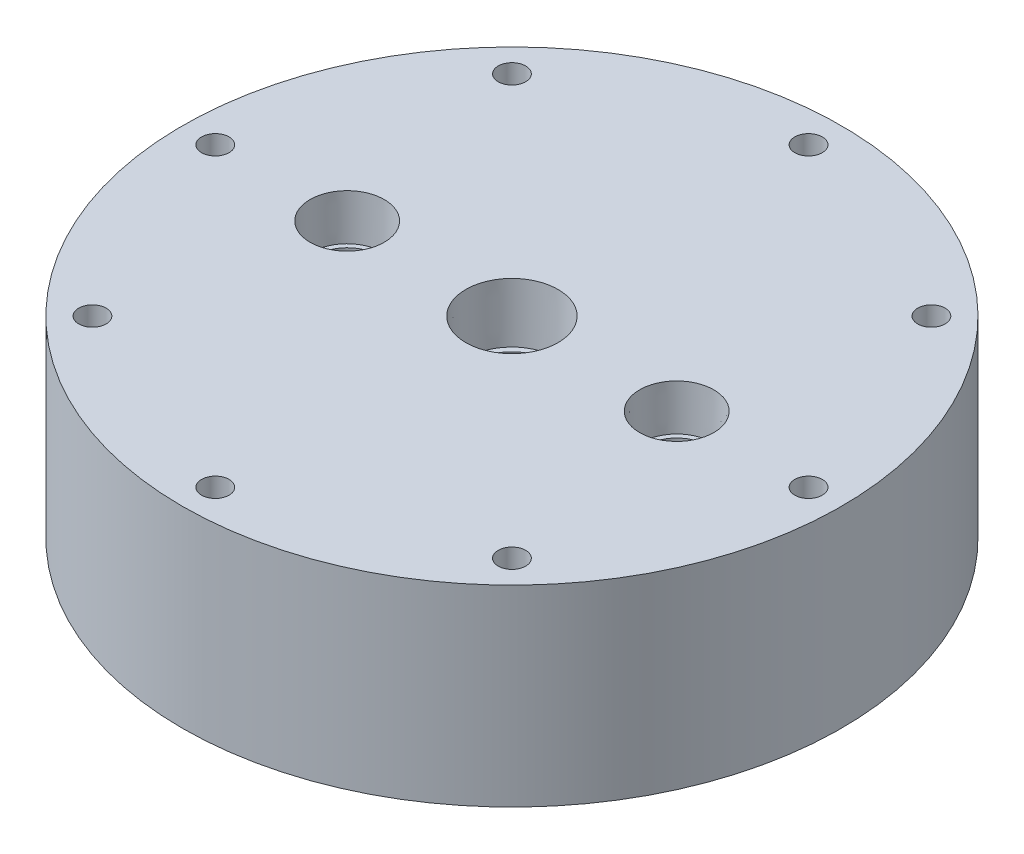
ISO-10303-21;
HEADER;
FILE_DESCRIPTION(('STEP AP214'),'2;1');
FILE_NAME('part.step','',(''),(''),'','','');
FILE_SCHEMA(('AUTOMOTIVE_DESIGN { 1 0 10303 214 1 1 1 1 }'));
ENDSEC;
DATA;
#1=APPLICATION_CONTEXT('core data for automotive mechanical design processes');
#2=APPLICATION_PROTOCOL_DEFINITION('international standard','automotive_design',2000,#1);
#3=PRODUCT_CONTEXT('',#1,'mechanical');
#4=PRODUCT('Part','Part','',(#3));
#5=PRODUCT_RELATED_PRODUCT_CATEGORY('part','',(#4));
#6=PRODUCT_DEFINITION_FORMATION('','',#4);
#7=PRODUCT_DEFINITION_CONTEXT('part definition',#1,'design');
#8=PRODUCT_DEFINITION('design','',#6,#7);
#9=PRODUCT_DEFINITION_SHAPE('','',#8);
#10=(LENGTH_UNIT() NAMED_UNIT(*) SI_UNIT(.MILLI.,.METRE.));
#11=(NAMED_UNIT(*) PLANE_ANGLE_UNIT() SI_UNIT($,.RADIAN.));
#12=(NAMED_UNIT(*) SI_UNIT($,.STERADIAN.) SOLID_ANGLE_UNIT());
#13=UNCERTAINTY_MEASURE_WITH_UNIT(LENGTH_MEASURE(1.E-05),#10,'distance_accuracy_value','');
#14=(GEOMETRIC_REPRESENTATION_CONTEXT(3) GLOBAL_UNCERTAINTY_ASSIGNED_CONTEXT((#13)) GLOBAL_UNIT_ASSIGNED_CONTEXT((#10,
#11,#12)) REPRESENTATION_CONTEXT('',''));
#15=CARTESIAN_POINT('',(0.,0.,0.));
#16=DIRECTION('',(0.,0.,1.));
#17=DIRECTION('',(1.,0.,0.));
#18=AXIS2_PLACEMENT_3D('',#15,#16,#17);
#19=CARTESIAN_POINT('',(76.2,44.45,0.));
#20=DIRECTION('',(0.,-1.,0.));
#21=DIRECTION('',(0.,0.,-1.));
#22=AXIS2_PLACEMENT_3D('',#19,#20,#21);
#23=PLANE('',#22);
#24=CARTESIAN_POINT('',(0.,44.45,-68.58));
#25=DIRECTION('',(0.,1.,0.));
#26=DIRECTION('',(0.,0.,1.));
#27=AXIS2_PLACEMENT_3D('',#24,#25,#26);
#28=CIRCLE('',#27,3.175);
#29=CARTESIAN_POINT('',(0.,44.45,-65.405));
#30=VERTEX_POINT('',#29);
#31=EDGE_CURVE('E131',#30,#30,#28,.T.);
#32=ORIENTED_EDGE('',*,*,#31,.F.);
#33=EDGE_LOOP('',(#32));
#34=FACE_BOUND('',#33,.T.);
#35=CARTESIAN_POINT('',(48.4933830537742,44.45,-48.4933830537727));
#36=DIRECTION('',(0.,1.,0.));
#37=DIRECTION('',(0.,0.,1.));
#38=AXIS2_PLACEMENT_3D('',#35,#36,#37);
#39=CIRCLE('',#38,3.17500000000031);
#40=CARTESIAN_POINT('',(48.4933830537742,44.45,-45.3183830537724));
#41=VERTEX_POINT('',#40);
#42=EDGE_CURVE('E135',#41,#41,#39,.T.);
#43=ORIENTED_EDGE('',*,*,#42,.F.);
#44=EDGE_LOOP('',(#43));
#45=FACE_BOUND('',#44,.T.);
#46=CARTESIAN_POINT('',(68.58,44.45,1.14838694109665E-12));
#47=DIRECTION('',(0.,1.,0.));
#48=DIRECTION('',(0.,0.,1.));
#49=AXIS2_PLACEMENT_3D('',#46,#47,#48);
#50=CIRCLE('',#49,3.17500000000001);
#51=CARTESIAN_POINT('',(68.58,44.45,3.17500000000116));
#52=VERTEX_POINT('',#51);
#53=EDGE_CURVE('E139',#52,#52,#50,.T.);
#54=ORIENTED_EDGE('',*,*,#53,.F.);
#55=EDGE_LOOP('',(#54));
#56=FACE_BOUND('',#55,.T.);
#57=CARTESIAN_POINT('',(48.4933830537725,44.45,48.4933830537744));
#58=DIRECTION('',(0.,1.,0.));
#59=DIRECTION('',(0.,0.,1.));
#60=AXIS2_PLACEMENT_3D('',#57,#58,#59);
#61=CIRCLE('',#60,3.175);
#62=CARTESIAN_POINT('',(48.4933830537725,44.45,51.6683830537744));
#63=VERTEX_POINT('',#62);
#64=EDGE_CURVE('E143',#63,#63,#61,.T.);
#65=ORIENTED_EDGE('',*,*,#64,.F.);
#66=EDGE_LOOP('',(#65));
#67=FACE_BOUND('',#66,.T.);
#68=CARTESIAN_POINT('',(-1.39471767468535E-12,44.45,68.58));
#69=DIRECTION('',(0.,1.,0.));
#70=DIRECTION('',(0.,0.,1.));
#71=AXIS2_PLACEMENT_3D('',#68,#69,#70);
#72=CIRCLE('',#71,3.175);
#73=CARTESIAN_POINT('',(-1.39471767468535E-12,44.45,71.755));
#74=VERTEX_POINT('',#73);
#75=EDGE_CURVE('E147',#74,#74,#72,.T.);
#76=ORIENTED_EDGE('',*,*,#75,.F.);
#77=EDGE_LOOP('',(#76));
#78=FACE_BOUND('',#77,.T.);
#79=CARTESIAN_POINT('',(-48.4933830537738,44.45,48.493383053773));
#80=DIRECTION('',(0.,1.,0.));
#81=DIRECTION('',(0.,0.,1.));
#82=AXIS2_PLACEMENT_3D('',#79,#80,#81);
#83=CIRCLE('',#82,3.17499999999999);
#84=CARTESIAN_POINT('',(-48.4933830537738,44.45,51.668383053773));
#85=VERTEX_POINT('',#84);
#86=EDGE_CURVE('E151',#85,#85,#83,.T.);
#87=ORIENTED_EDGE('',*,*,#86,.F.);
#88=EDGE_LOOP('',(#87));
#89=FACE_BOUND('',#88,.T.);
#90=CARTESIAN_POINT('',(-68.58,44.45,-6.86950496486816E-13));
#91=DIRECTION('',(0.,1.,0.));
#92=DIRECTION('',(0.,0.,1.));
#93=AXIS2_PLACEMENT_3D('',#90,#91,#92);
#94=CIRCLE('',#93,3.17499999999999);
#95=CARTESIAN_POINT('',(-68.58,44.45,3.1749999999993));
#96=VERTEX_POINT('',#95);
#97=EDGE_CURVE('E155',#96,#96,#94,.T.);
#98=ORIENTED_EDGE('',*,*,#97,.F.);
#99=EDGE_LOOP('',(#98));
#100=FACE_BOUND('',#99,.T.);
#101=CARTESIAN_POINT('',(-48.4933830537728,44.45,-48.493383053774));
#102=DIRECTION('',(0.,1.,0.));
#103=DIRECTION('',(0.,0.,1.));
#104=AXIS2_PLACEMENT_3D('',#101,#102,#103);
#105=CIRCLE('',#104,3.17499999999999);
#106=CARTESIAN_POINT('',(-48.4933830537728,44.45,-45.318383053774));
#107=VERTEX_POINT('',#106);
#108=EDGE_CURVE('E159',#107,#107,#105,.T.);
#109=ORIENTED_EDGE('',*,*,#108,.F.);
#110=EDGE_LOOP('',(#109));
#111=FACE_BOUND('',#110,.T.);
#112=CARTESIAN_POINT('',(-38.1,44.45,0.));
#113=DIRECTION('',(0.,1.,0.));
#114=DIRECTION('',(0.,0.,1.));
#115=AXIS2_PLACEMENT_3D('',#112,#113,#114);
#116=CIRCLE('',#115,8.5750146);
#117=CARTESIAN_POINT('',(-38.1,44.45,8.5750146));
#118=VERTEX_POINT('',#117);
#119=EDGE_CURVE('E163',#118,#118,#116,.T.);
#120=ORIENTED_EDGE('',*,*,#119,.F.);
#121=EDGE_LOOP('',(#120));
#122=FACE_BOUND('',#121,.T.);
#123=CARTESIAN_POINT('',(38.1,44.45,0.));
#124=DIRECTION('',(0.,1.,0.));
#125=DIRECTION('',(0.,0.,1.));
#126=AXIS2_PLACEMENT_3D('',#123,#124,#125);
#127=CIRCLE('',#126,8.5750146);
#128=CARTESIAN_POINT('',(38.1,44.45,8.57501459999999));
#129=VERTEX_POINT('',#128);
#130=EDGE_CURVE('E72',#129,#129,#127,.T.);
#131=ORIENTED_EDGE('',*,*,#130,.F.);
#132=EDGE_LOOP('',(#131));
#133=FACE_BOUND('',#132,.T.);
#134=CARTESIAN_POINT('',(0.,44.45,0.));
#135=DIRECTION('',(0.,1.,0.));
#136=DIRECTION('',(0.,0.,1.));
#137=AXIS2_PLACEMENT_3D('',#134,#135,#136);
#138=CIRCLE('',#137,10.6647361);
#139=CARTESIAN_POINT('',(0.,44.45,10.6647361));
#140=VERTEX_POINT('',#139);
#141=EDGE_CURVE('E59',#140,#140,#138,.T.);
#142=ORIENTED_EDGE('',*,*,#141,.F.);
#143=EDGE_LOOP('',(#142));
#144=FACE_BOUND('',#143,.T.);
#145=CARTESIAN_POINT('',(0.,44.45,0.));
#146=DIRECTION('',(0.,1.,0.));
#147=DIRECTION('',(0.,0.,1.));
#148=AXIS2_PLACEMENT_3D('',#145,#146,#147);
#149=CIRCLE('',#148,76.2);
#150=CARTESIAN_POINT('',(0.,44.45,76.2));
#151=VERTEX_POINT('',#150);
#152=EDGE_CURVE('E55',#151,#151,#149,.T.);
#153=ORIENTED_EDGE('',*,*,#152,.T.);
#154=EDGE_LOOP('',(#153));
#155=FACE_BOUND('',#154,.T.);
#156=ADVANCED_FACE('F37',(#34,#45,#56,#67,#78,#89,#100,#111,#122,#133,#144,#155),#23,.F.);
#157=CARTESIAN_POINT('',(0.,22.86,0.));
#158=DIRECTION('',(0.,1.,0.));
#159=DIRECTION('',(0.,0.,1.));
#160=AXIS2_PLACEMENT_3D('',#157,#158,#159);
#161=PLANE('',#160);
#162=CARTESIAN_POINT('',(0.,22.86,0.));
#163=DIRECTION('',(0.,1.,0.));
#164=DIRECTION('',(0.,0.,1.));
#165=AXIS2_PLACEMENT_3D('',#162,#163,#164);
#166=CIRCLE('',#165,8.9281);
#167=CARTESIAN_POINT('',(0.,22.86,8.9281));
#168=VERTEX_POINT('',#167);
#169=EDGE_CURVE('E53',#168,#168,#166,.T.);
#170=ORIENTED_EDGE('',*,*,#169,.T.);
#171=EDGE_LOOP('',(#170));
#172=FACE_BOUND('',#171,.T.);
#173=CARTESIAN_POINT('',(0.,22.86,0.));
#174=DIRECTION('',(0.,1.,0.));
#175=DIRECTION('',(0.,0.,1.));
#176=AXIS2_PLACEMENT_3D('',#173,#174,#175);
#177=CIRCLE('',#176,22.225);
#178=CARTESIAN_POINT('',(0.,22.86,22.225));
#179=VERTEX_POINT('',#178);
#180=EDGE_CURVE('E10',#179,#179,#177,.T.);
#181=ORIENTED_EDGE('',*,*,#180,.F.);
#182=EDGE_LOOP('',(#181));
#183=FACE_BOUND('',#182,.T.);
#184=ADVANCED_FACE('F118',(#172,#183),#161,.F.);
#185=CARTESIAN_POINT('',(0.,0.,0.));
#186=DIRECTION('',(0.,1.,0.));
#187=DIRECTION('',(0.,0.,1.));
#188=AXIS2_PLACEMENT_3D('',#185,#186,#187);
#189=CYLINDRICAL_SURFACE('',#188,22.225);
#190=CARTESIAN_POINT('',(0.,12.7,0.));
#191=DIRECTION('',(0.,1.,0.));
#192=DIRECTION('',(0.,0.,1.));
#193=AXIS2_PLACEMENT_3D('',#190,#191,#192);
#194=CIRCLE('',#193,22.225);
#195=CARTESIAN_POINT('',(0.,12.7,22.225));
#196=VERTEX_POINT('',#195);
#197=EDGE_CURVE('E44',#196,#196,#194,.T.);
#198=ORIENTED_EDGE('',*,*,#197,.F.);
#199=EDGE_LOOP('',(#198));
#200=FACE_BOUND('',#199,.T.);
#201=ORIENTED_EDGE('',*,*,#180,.T.);
#202=EDGE_LOOP('',(#201));
#203=FACE_BOUND('',#202,.T.);
#204=ADVANCED_FACE('F113',(#200,#203),#189,.F.);
#205=CARTESIAN_POINT('',(22.225,12.7,0.));
#206=DIRECTION('',(0.,1.,0.));
#207=DIRECTION('',(0.,0.,1.));
#208=AXIS2_PLACEMENT_3D('',#205,#206,#207);
#209=PLANE('',#208);
#210=CARTESIAN_POINT('',(0.,12.7,0.));
#211=DIRECTION('',(0.,1.,0.));
#212=DIRECTION('',(0.,0.,1.));
#213=AXIS2_PLACEMENT_3D('',#210,#211,#212);
#214=CIRCLE('',#213,25.4);
#215=CARTESIAN_POINT('',(0.,12.7,25.4));
#216=VERTEX_POINT('',#215);
#217=EDGE_CURVE('E49',#216,#216,#214,.T.);
#218=ORIENTED_EDGE('',*,*,#217,.F.);
#219=EDGE_LOOP('',(#218));
#220=FACE_BOUND('',#219,.T.);
#221=ORIENTED_EDGE('',*,*,#197,.T.);
#222=EDGE_LOOP('',(#221));
#223=FACE_BOUND('',#222,.T.);
#224=ADVANCED_FACE('F110',(#220,#223),#209,.F.);
#225=CARTESIAN_POINT('',(0.,0.,0.));
#226=DIRECTION('',(0.,1.,0.));
#227=DIRECTION('',(0.,0.,1.));
#228=AXIS2_PLACEMENT_3D('',#225,#226,#227);
#229=CYLINDRICAL_SURFACE('',#228,25.4);
#230=CARTESIAN_POINT('',(0.,14.732,0.));
#231=DIRECTION('',(0.,1.,0.));
#232=DIRECTION('',(0.,0.,1.));
#233=AXIS2_PLACEMENT_3D('',#230,#231,#232);
#234=CIRCLE('',#233,25.4);
#235=CARTESIAN_POINT('',(0.,14.732,25.4));
#236=VERTEX_POINT('',#235);
#237=EDGE_CURVE('E103',#236,#236,#234,.T.);
#238=ORIENTED_EDGE('',*,*,#237,.F.);
#239=EDGE_LOOP('',(#238));
#240=FACE_BOUND('',#239,.T.);
#241=ORIENTED_EDGE('',*,*,#217,.T.);
#242=EDGE_LOOP('',(#241));
#243=FACE_BOUND('',#242,.T.);
#244=ADVANCED_FACE('F108',(#240,#243),#229,.T.);
#245=CARTESIAN_POINT('',(25.4,14.732,0.));
#246=DIRECTION('',(0.,1.,0.));
#247=DIRECTION('',(0.,0.,1.));
#248=AXIS2_PLACEMENT_3D('',#245,#246,#247);
#249=PLANE('',#248);
#250=CARTESIAN_POINT('',(0.,14.732,0.));
#251=DIRECTION('',(0.,1.,0.));
#252=DIRECTION('',(0.,0.,1.));
#253=AXIS2_PLACEMENT_3D('',#250,#251,#252);
#254=CIRCLE('',#253,27.432);
#255=CARTESIAN_POINT('',(0.,14.732,27.432));
#256=VERTEX_POINT('',#255);
#257=EDGE_CURVE('E100',#256,#256,#254,.T.);
#258=ORIENTED_EDGE('',*,*,#257,.F.);
#259=EDGE_LOOP('',(#258));
#260=FACE_BOUND('',#259,.T.);
#261=ORIENTED_EDGE('',*,*,#237,.T.);
#262=EDGE_LOOP('',(#261));
#263=FACE_BOUND('',#262,.T.);
#264=ADVANCED_FACE('F213',(#260,#263),#249,.F.);
#265=CARTESIAN_POINT('',(0.,0.,0.));
#266=DIRECTION('',(0.,1.,0.));
#267=DIRECTION('',(0.,0.,1.));
#268=AXIS2_PLACEMENT_3D('',#265,#266,#267);
#269=CYLINDRICAL_SURFACE('',#268,27.432);
#270=CARTESIAN_POINT('',(0.,12.7,0.));
#271=DIRECTION('',(0.,1.,0.));
#272=DIRECTION('',(0.,0.,1.));
#273=AXIS2_PLACEMENT_3D('',#270,#271,#272);
#274=CIRCLE('',#273,27.432);
#275=CARTESIAN_POINT('',(0.,12.7,27.432));
#276=VERTEX_POINT('',#275);
#277=EDGE_CURVE('E97',#276,#276,#274,.T.);
#278=ORIENTED_EDGE('',*,*,#277,.F.);
#279=EDGE_LOOP('',(#278));
#280=FACE_BOUND('',#279,.T.);
#281=ORIENTED_EDGE('',*,*,#257,.T.);
#282=EDGE_LOOP('',(#281));
#283=FACE_BOUND('',#282,.T.);
#284=ADVANCED_FACE('F207',(#280,#283),#269,.F.);
#285=CARTESIAN_POINT('',(27.432,12.7,0.));
#286=DIRECTION('',(0.,1.,0.));
#287=DIRECTION('',(0.,0.,1.));
#288=AXIS2_PLACEMENT_3D('',#285,#286,#287);
#289=PLANE('',#288);
#290=CARTESIAN_POINT('',(0.,12.7,0.));
#291=DIRECTION('',(0.,1.,0.));
#292=DIRECTION('',(0.,0.,1.));
#293=AXIS2_PLACEMENT_3D('',#290,#291,#292);
#294=CIRCLE('',#293,28.575);
#295=CARTESIAN_POINT('',(0.,12.7,28.575));
#296=VERTEX_POINT('',#295);
#297=EDGE_CURVE('E94',#296,#296,#294,.T.);
#298=ORIENTED_EDGE('',*,*,#297,.F.);
#299=EDGE_LOOP('',(#298));
#300=FACE_BOUND('',#299,.T.);
#301=ORIENTED_EDGE('',*,*,#277,.T.);
#302=EDGE_LOOP('',(#301));
#303=FACE_BOUND('',#302,.T.);
#304=ADVANCED_FACE('F201',(#300,#303),#289,.F.);
#305=CARTESIAN_POINT('',(0.,0.,0.));
#306=DIRECTION('',(0.,1.,0.));
#307=DIRECTION('',(0.,0.,1.));
#308=AXIS2_PLACEMENT_3D('',#305,#306,#307);
#309=CYLINDRICAL_SURFACE('',#308,28.575);
#310=CARTESIAN_POINT('',(0.,6.35,0.));
#311=DIRECTION('',(0.,1.,0.));
#312=DIRECTION('',(0.,0.,1.));
#313=AXIS2_PLACEMENT_3D('',#310,#311,#312);
#314=CIRCLE('',#313,28.575);
#315=CARTESIAN_POINT('',(0.,6.35,28.575));
#316=VERTEX_POINT('',#315);
#317=EDGE_CURVE('E91',#316,#316,#314,.T.);
#318=ORIENTED_EDGE('',*,*,#317,.F.);
#319=EDGE_LOOP('',(#318));
#320=FACE_BOUND('',#319,.T.);
#321=ORIENTED_EDGE('',*,*,#297,.T.);
#322=EDGE_LOOP('',(#321));
#323=FACE_BOUND('',#322,.T.);
#324=ADVANCED_FACE('F194',(#320,#323),#309,.F.);
#325=CARTESIAN_POINT('',(28.575,6.35,0.));
#326=DIRECTION('',(0.,1.,0.));
#327=DIRECTION('',(0.,0.,1.));
#328=AXIS2_PLACEMENT_3D('',#325,#326,#327);
#329=PLANE('',#328);
#330=CARTESIAN_POINT('',(0.,6.35,46.355));
#331=DIRECTION('',(0.,-1.,0.));
#332=DIRECTION('',(0.,0.,-1.));
#333=AXIS2_PLACEMENT_3D('',#330,#331,#332);
#334=CIRCLE('',#333,1.27);
#335=CARTESIAN_POINT('',(0.,6.35,45.085));
#336=VERTEX_POINT('',#335);
#337=EDGE_CURVE('E313',#336,#336,#334,.T.);
#338=ORIENTED_EDGE('',*,*,#337,.F.);
#339=EDGE_LOOP('',(#338));
#340=FACE_BOUND('',#339,.T.);
#341=CARTESIAN_POINT('',(0.,6.35,-46.355));
#342=DIRECTION('',(0.,-1.,0.));
#343=DIRECTION('',(0.,0.,-1.));
#344=AXIS2_PLACEMENT_3D('',#341,#342,#343);
#345=CIRCLE('',#344,1.27);
#346=CARTESIAN_POINT('',(0.,6.35,-47.625));
#347=VERTEX_POINT('',#346);
#348=EDGE_CURVE('E323',#347,#347,#345,.T.);
#349=ORIENTED_EDGE('',*,*,#348,.F.);
#350=EDGE_LOOP('',(#349));
#351=FACE_BOUND('',#350,.T.);
#352=CARTESIAN_POINT('',(-38.1,6.35,0.));
#353=DIRECTION('',(0.,1.,0.));
#354=DIRECTION('',(0.,0.,1.));
#355=AXIS2_PLACEMENT_3D('',#352,#353,#354);
#356=CIRCLE('',#355,7.1374);
#357=CARTESIAN_POINT('',(-38.1,6.35,7.1374));
#358=VERTEX_POINT('',#357);
#359=EDGE_CURVE('E40',#358,#358,#356,.T.);
#360=ORIENTED_EDGE('',*,*,#359,.T.);
#361=EDGE_LOOP('',(#360));
#362=FACE_BOUND('',#361,.T.);
#363=CARTESIAN_POINT('',(38.1,6.35,0.));
#364=DIRECTION('',(0.,1.,0.));
#365=DIRECTION('',(0.,0.,1.));
#366=AXIS2_PLACEMENT_3D('',#363,#364,#365);
#367=CIRCLE('',#366,7.1374);
#368=CARTESIAN_POINT('',(38.1,6.35,7.13739999999999));
#369=VERTEX_POINT('',#368);
#370=EDGE_CURVE('E57',#369,#369,#367,.T.);
#371=ORIENTED_EDGE('',*,*,#370,.T.);
#372=EDGE_LOOP('',(#371));
#373=FACE_BOUND('',#372,.T.);
#374=CARTESIAN_POINT('',(0.,6.35,0.));
#375=DIRECTION('',(0.,1.,0.));
#376=DIRECTION('',(0.,0.,1.));
#377=AXIS2_PLACEMENT_3D('',#374,#375,#376);
#378=CIRCLE('',#377,57.15);
#379=CARTESIAN_POINT('',(0.,6.35,57.15));
#380=VERTEX_POINT('',#379);
#381=EDGE_CURVE('E88',#380,#380,#378,.T.);
#382=ORIENTED_EDGE('',*,*,#381,.F.);
#383=EDGE_LOOP('',(#382));
#384=FACE_BOUND('',#383,.T.);
#385=ORIENTED_EDGE('',*,*,#317,.T.);
#386=EDGE_LOOP('',(#385));
#387=FACE_BOUND('',#386,.T.);
#388=ADVANCED_FACE('F188',(#340,#351,#362,#373,#384,#387),#329,.F.);
#389=CARTESIAN_POINT('',(0.,0.,0.));
#390=DIRECTION('',(0.,1.,0.));
#391=DIRECTION('',(0.,0.,1.));
#392=AXIS2_PLACEMENT_3D('',#389,#390,#391);
#393=CYLINDRICAL_SURFACE('',#392,57.15);
#394=CARTESIAN_POINT('',(0.,0.,0.));
#395=DIRECTION('',(0.,1.,0.));
#396=DIRECTION('',(0.,0.,1.));
#397=AXIS2_PLACEMENT_3D('',#394,#395,#396);
#398=CIRCLE('',#397,57.15);
#399=CARTESIAN_POINT('',(0.,0.,57.15));
#400=VERTEX_POINT('',#399);
#401=EDGE_CURVE('E85',#400,#400,#398,.T.);
#402=ORIENTED_EDGE('',*,*,#401,.F.);
#403=EDGE_LOOP('',(#402));
#404=FACE_BOUND('',#403,.T.);
#405=ORIENTED_EDGE('',*,*,#381,.T.);
#406=EDGE_LOOP('',(#405));
#407=FACE_BOUND('',#406,.T.);
#408=ADVANCED_FACE('F181',(#404,#407),#393,.F.);
#409=CARTESIAN_POINT('',(57.15,0.,0.));
#410=DIRECTION('',(0.,1.,0.));
#411=DIRECTION('',(0.,0.,1.));
#412=AXIS2_PLACEMENT_3D('',#409,#410,#411);
#413=PLANE('',#412);
#414=CARTESIAN_POINT('',(0.,0.,-68.58));
#415=DIRECTION('',(0.,1.,0.));
#416=DIRECTION('',(0.,0.,1.));
#417=AXIS2_PLACEMENT_3D('',#414,#415,#416);
#418=CIRCLE('',#417,3.175);
#419=CARTESIAN_POINT('',(0.,0.,-65.405));
#420=VERTEX_POINT('',#419);
#421=EDGE_CURVE('E326',#420,#420,#418,.T.);
#422=ORIENTED_EDGE('',*,*,#421,.T.);
#423=EDGE_LOOP('',(#422));
#424=FACE_BOUND('',#423,.T.);
#425=CARTESIAN_POINT('',(48.4933830537742,0.,-48.4933830537727));
#426=DIRECTION('',(0.,1.,0.));
#427=DIRECTION('',(0.,0.,1.));
#428=AXIS2_PLACEMENT_3D('',#425,#426,#427);
#429=CIRCLE('',#428,3.17500000000031);
#430=CARTESIAN_POINT('',(48.4933830537742,0.,-45.3183830537724));
#431=VERTEX_POINT('',#430);
#432=EDGE_CURVE('E330',#431,#431,#429,.T.);
#433=ORIENTED_EDGE('',*,*,#432,.T.);
#434=EDGE_LOOP('',(#433));
#435=FACE_BOUND('',#434,.T.);
#436=CARTESIAN_POINT('',(68.58,0.,1.14838694109665E-12));
#437=DIRECTION('',(0.,1.,0.));
#438=DIRECTION('',(0.,0.,1.));
#439=AXIS2_PLACEMENT_3D('',#436,#437,#438);
#440=CIRCLE('',#439,3.17500000000001);
#441=CARTESIAN_POINT('',(68.58,0.,3.17500000000116));
#442=VERTEX_POINT('',#441);
#443=EDGE_CURVE('E334',#442,#442,#440,.T.);
#444=ORIENTED_EDGE('',*,*,#443,.T.);
#445=EDGE_LOOP('',(#444));
#446=FACE_BOUND('',#445,.T.);
#447=CARTESIAN_POINT('',(48.4933830537725,0.,48.4933830537744));
#448=DIRECTION('',(0.,1.,0.));
#449=DIRECTION('',(0.,0.,1.));
#450=AXIS2_PLACEMENT_3D('',#447,#448,#449);
#451=CIRCLE('',#450,3.175);
#452=CARTESIAN_POINT('',(48.4933830537725,0.,51.6683830537744));
#453=VERTEX_POINT('',#452);
#454=EDGE_CURVE('E338',#453,#453,#451,.T.);
#455=ORIENTED_EDGE('',*,*,#454,.T.);
#456=EDGE_LOOP('',(#455));
#457=FACE_BOUND('',#456,.T.);
#458=CARTESIAN_POINT('',(-1.39471767468535E-12,0.,68.58));
#459=DIRECTION('',(0.,1.,0.));
#460=DIRECTION('',(0.,0.,1.));
#461=AXIS2_PLACEMENT_3D('',#458,#459,#460);
#462=CIRCLE('',#461,3.175);
#463=CARTESIAN_POINT('',(-1.39471767468535E-12,0.,71.755));
#464=VERTEX_POINT('',#463);
#465=EDGE_CURVE('E342',#464,#464,#462,.T.);
#466=ORIENTED_EDGE('',*,*,#465,.T.);
#467=EDGE_LOOP('',(#466));
#468=FACE_BOUND('',#467,.T.);
#469=CARTESIAN_POINT('',(-48.4933830537738,0.,48.493383053773));
#470=DIRECTION('',(0.,1.,0.));
#471=DIRECTION('',(0.,0.,1.));
#472=AXIS2_PLACEMENT_3D('',#469,#470,#471);
#473=CIRCLE('',#472,3.17499999999999);
#474=CARTESIAN_POINT('',(-48.4933830537738,0.,51.668383053773));
#475=VERTEX_POINT('',#474);
#476=EDGE_CURVE('E346',#475,#475,#473,.T.);
#477=ORIENTED_EDGE('',*,*,#476,.T.);
#478=EDGE_LOOP('',(#477));
#479=FACE_BOUND('',#478,.T.);
#480=CARTESIAN_POINT('',(-68.58,0.,-6.86950496486816E-13));
#481=DIRECTION('',(0.,1.,0.));
#482=DIRECTION('',(0.,0.,1.));
#483=AXIS2_PLACEMENT_3D('',#480,#481,#482);
#484=CIRCLE('',#483,3.17499999999999);
#485=CARTESIAN_POINT('',(-68.58,0.,3.1749999999993));
#486=VERTEX_POINT('',#485);
#487=EDGE_CURVE('E350',#486,#486,#484,.T.);
#488=ORIENTED_EDGE('',*,*,#487,.T.);
#489=EDGE_LOOP('',(#488));
#490=FACE_BOUND('',#489,.T.);
#491=CARTESIAN_POINT('',(-48.4933830537728,0.,-48.493383053774));
#492=DIRECTION('',(0.,1.,0.));
#493=DIRECTION('',(0.,0.,1.));
#494=AXIS2_PLACEMENT_3D('',#491,#492,#493);
#495=CIRCLE('',#494,3.17499999999999);
#496=CARTESIAN_POINT('',(-48.4933830537728,0.,-45.318383053774));
#497=VERTEX_POINT('',#496);
#498=EDGE_CURVE('E315',#497,#497,#495,.T.);
#499=ORIENTED_EDGE('',*,*,#498,.T.);
#500=EDGE_LOOP('',(#499));
#501=FACE_BOUND('',#500,.T.);
#502=CARTESIAN_POINT('',(0.,0.,0.));
#503=DIRECTION('',(0.,1.,0.));
#504=DIRECTION('',(0.,0.,1.));
#505=AXIS2_PLACEMENT_3D('',#502,#503,#504);
#506=CIRCLE('',#505,76.2);
#507=CARTESIAN_POINT('',(0.,0.,76.2));
#508=VERTEX_POINT('',#507);
#509=EDGE_CURVE('E82',#508,#508,#506,.T.);
#510=ORIENTED_EDGE('',*,*,#509,.F.);
#511=EDGE_LOOP('',(#510));
#512=FACE_BOUND('',#511,.T.);
#513=ORIENTED_EDGE('',*,*,#401,.T.);
#514=EDGE_LOOP('',(#513));
#515=FACE_BOUND('',#514,.T.);
#516=ADVANCED_FACE('F175',(#424,#435,#446,#457,#468,#479,#490,#501,#512,#515),#413,.F.);
#517=CARTESIAN_POINT('',(0.,0.,0.));
#518=DIRECTION('',(0.,1.,0.));
#519=DIRECTION('',(0.,0.,1.));
#520=AXIS2_PLACEMENT_3D('',#517,#518,#519);
#521=CYLINDRICAL_SURFACE('',#520,76.2);
#522=ORIENTED_EDGE('',*,*,#152,.F.);
#523=EDGE_LOOP('',(#522));
#524=FACE_BOUND('',#523,.T.);
#525=ORIENTED_EDGE('',*,*,#509,.T.);
#526=EDGE_LOOP('',(#525));
#527=FACE_BOUND('',#526,.T.);
#528=ADVANCED_FACE('F171',(#524,#527),#521,.T.);
#529=CARTESIAN_POINT('',(0.,44.45,0.));
#530=DIRECTION('',(0.,1.,0.));
#531=DIRECTION('',(0.,0.,1.));
#532=AXIS2_PLACEMENT_3D('',#529,#530,#531);
#533=CYLINDRICAL_SURFACE('',#532,8.9281);
#534=CARTESIAN_POINT('',(0.,30.988,0.));
#535=DIRECTION('',(0.,1.,0.));
#536=DIRECTION('',(0.,0.,1.));
#537=AXIS2_PLACEMENT_3D('',#534,#535,#536);
#538=CIRCLE('',#537,8.9281);
#539=CARTESIAN_POINT('',(0.,30.988,8.9281));
#540=VERTEX_POINT('',#539);
#541=EDGE_CURVE('E56',#540,#540,#538,.T.);
#542=ORIENTED_EDGE('',*,*,#541,.T.);
#543=EDGE_LOOP('',(#542));
#544=FACE_BOUND('',#543,.T.);
#545=ORIENTED_EDGE('',*,*,#169,.F.);
#546=EDGE_LOOP('',(#545));
#547=FACE_BOUND('',#546,.T.);
#548=ADVANCED_FACE('F174',(#544,#547),#533,.F.);
#549=CARTESIAN_POINT('',(8.9281,30.988,0.));
#550=DIRECTION('',(0.,-1.,0.));
#551=DIRECTION('',(0.,0.,-1.));
#552=AXIS2_PLACEMENT_3D('',#549,#550,#551);
#553=PLANE('',#552);
#554=ORIENTED_EDGE('',*,*,#541,.F.);
#555=EDGE_LOOP('',(#554));
#556=FACE_BOUND('',#555,.T.);
#557=CARTESIAN_POINT('',(0.,30.988,0.));
#558=DIRECTION('',(0.,1.,0.));
#559=DIRECTION('',(0.,0.,1.));
#560=AXIS2_PLACEMENT_3D('',#557,#558,#559);
#561=CIRCLE('',#560,10.2616657920863);
#562=CARTESIAN_POINT('',(0.,30.988,10.2616657920863));
#563=VERTEX_POINT('',#562);
#564=EDGE_CURVE('E64',#563,#563,#561,.T.);
#565=ORIENTED_EDGE('',*,*,#564,.T.);
#566=EDGE_LOOP('',(#565));
#567=FACE_BOUND('',#566,.T.);
#568=ADVANCED_FACE('F229',(#556,#567),#553,.F.);
#569=CARTESIAN_POINT('',(0.,44.45,0.));
#570=DIRECTION('',(0.,1.,0.));
#571=DIRECTION('',(0.,0.,1.));
#572=AXIS2_PLACEMENT_3D('',#569,#570,#571);
#573=CONICAL_SURFACE('',#572,10.6647361,0.0299323966717029);
#574=ORIENTED_EDGE('',*,*,#564,.F.);
#575=EDGE_LOOP('',(#574));
#576=FACE_BOUND('',#575,.T.);
#577=ORIENTED_EDGE('',*,*,#141,.T.);
#578=EDGE_LOOP('',(#577));
#579=FACE_BOUND('',#578,.T.);
#580=ADVANCED_FACE('F233',(#576,#579),#573,.F.);
#581=CARTESIAN_POINT('',(38.1,44.45,0.));
#582=DIRECTION('',(0.,1.,0.));
#583=DIRECTION('',(0.,0.,1.));
#584=AXIS2_PLACEMENT_3D('',#581,#582,#583);
#585=CYLINDRICAL_SURFACE('',#584,7.1374);
#586=CARTESIAN_POINT('',(38.1,34.036,0.));
#587=DIRECTION('',(0.,1.,0.));
#588=DIRECTION('',(0.,0.,1.));
#589=AXIS2_PLACEMENT_3D('',#586,#587,#588);
#590=CIRCLE('',#589,7.1374);
#591=CARTESIAN_POINT('',(38.1,34.036,7.13739999999999));
#592=VERTEX_POINT('',#591);
#593=EDGE_CURVE('E60',#592,#592,#590,.T.);
#594=ORIENTED_EDGE('',*,*,#593,.T.);
#595=EDGE_LOOP('',(#594));
#596=FACE_BOUND('',#595,.T.);
#597=ORIENTED_EDGE('',*,*,#370,.F.);
#598=EDGE_LOOP('',(#597));
#599=FACE_BOUND('',#598,.T.);
#600=ADVANCED_FACE('F237',(#596,#599),#585,.F.);
#601=CARTESIAN_POINT('',(45.2374,34.036,0.));
#602=DIRECTION('',(0.,-1.,0.));
#603=DIRECTION('',(0.,0.,-1.));
#604=AXIS2_PLACEMENT_3D('',#601,#602,#603);
#605=PLANE('',#604);
#606=ORIENTED_EDGE('',*,*,#593,.F.);
#607=EDGE_LOOP('',(#606));
#608=FACE_BOUND('',#607,.T.);
#609=CARTESIAN_POINT('',(38.1,34.036,0.));
#610=DIRECTION('',(0.,1.,0.));
#611=DIRECTION('',(0.,0.,1.));
#612=AXIS2_PLACEMENT_3D('',#609,#610,#611);
#613=CIRCLE('',#612,8.26320549387809);
#614=CARTESIAN_POINT('',(38.1,34.036,8.26320549387807));
#615=VERTEX_POINT('',#614);
#616=EDGE_CURVE('E67',#615,#615,#613,.T.);
#617=ORIENTED_EDGE('',*,*,#616,.T.);
#618=EDGE_LOOP('',(#617));
#619=FACE_BOUND('',#618,.T.);
#620=ADVANCED_FACE('F241',(#608,#619),#605,.F.);
#621=CARTESIAN_POINT('',(38.1,44.45,0.));
#622=DIRECTION('',(0.,1.,0.));
#623=DIRECTION('',(0.,0.,1.));
#624=AXIS2_PLACEMENT_3D('',#621,#622,#623);
#625=CONICAL_SURFACE('',#624,8.5750146,0.0299323966717029);
#626=ORIENTED_EDGE('',*,*,#616,.F.);
#627=EDGE_LOOP('',(#626));
#628=FACE_BOUND('',#627,.T.);
#629=ORIENTED_EDGE('',*,*,#130,.T.);
#630=EDGE_LOOP('',(#629));
#631=FACE_BOUND('',#630,.T.);
#632=ADVANCED_FACE('F244',(#628,#631),#625,.F.);
#633=CARTESIAN_POINT('',(-38.1,44.45,0.));
#634=DIRECTION('',(0.,1.,0.));
#635=DIRECTION('',(0.,0.,1.));
#636=AXIS2_PLACEMENT_3D('',#633,#634,#635);
#637=CYLINDRICAL_SURFACE('',#636,7.1374);
#638=CARTESIAN_POINT('',(-38.1,34.036,0.));
#639=DIRECTION('',(0.,1.,0.));
#640=DIRECTION('',(0.,0.,1.));
#641=AXIS2_PLACEMENT_3D('',#638,#639,#640);
#642=CIRCLE('',#641,7.1374);
#643=CARTESIAN_POINT('',(-38.1,34.036,7.1374));
#644=VERTEX_POINT('',#643);
#645=EDGE_CURVE('E360',#644,#644,#642,.T.);
#646=ORIENTED_EDGE('',*,*,#645,.T.);
#647=EDGE_LOOP('',(#646));
#648=FACE_BOUND('',#647,.T.);
#649=ORIENTED_EDGE('',*,*,#359,.F.);
#650=EDGE_LOOP('',(#649));
#651=FACE_BOUND('',#650,.T.);
#652=ADVANCED_FACE('F248',(#648,#651),#637,.F.);
#653=CARTESIAN_POINT('',(-30.9626,34.036,0.));
#654=DIRECTION('',(0.,-1.,0.));
#655=DIRECTION('',(0.,0.,-1.));
#656=AXIS2_PLACEMENT_3D('',#653,#654,#655);
#657=PLANE('',#656);
#658=ORIENTED_EDGE('',*,*,#645,.F.);
#659=EDGE_LOOP('',(#658));
#660=FACE_BOUND('',#659,.T.);
#661=CARTESIAN_POINT('',(-38.1,34.036,0.));
#662=DIRECTION('',(0.,1.,0.));
#663=DIRECTION('',(0.,0.,1.));
#664=AXIS2_PLACEMENT_3D('',#661,#662,#663);
#665=CIRCLE('',#664,8.26320549387809);
#666=CARTESIAN_POINT('',(-38.1,34.036,8.26320549387809));
#667=VERTEX_POINT('',#666);
#668=EDGE_CURVE('E357',#667,#667,#665,.T.);
#669=ORIENTED_EDGE('',*,*,#668,.T.);
#670=EDGE_LOOP('',(#669));
#671=FACE_BOUND('',#670,.T.);
#672=ADVANCED_FACE('F252',(#660,#671),#657,.F.);
#673=CARTESIAN_POINT('',(-38.1,44.45,0.));
#674=DIRECTION('',(0.,1.,0.));
#675=DIRECTION('',(0.,0.,1.));
#676=AXIS2_PLACEMENT_3D('',#673,#674,#675);
#677=CONICAL_SURFACE('',#676,8.5750146,0.0299323966717029);
#678=ORIENTED_EDGE('',*,*,#668,.F.);
#679=EDGE_LOOP('',(#678));
#680=FACE_BOUND('',#679,.T.);
#681=ORIENTED_EDGE('',*,*,#119,.T.);
#682=EDGE_LOOP('',(#681));
#683=FACE_BOUND('',#682,.T.);
#684=ADVANCED_FACE('F256',(#680,#683),#677,.F.);
#685=CARTESIAN_POINT('',(-48.4933830537728,0.,-48.493383053774));
#686=DIRECTION('',(0.,1.,0.));
#687=DIRECTION('',(0.,0.,1.));
#688=AXIS2_PLACEMENT_3D('',#685,#686,#687);
#689=CYLINDRICAL_SURFACE('',#688,3.17499999999999);
#690=ORIENTED_EDGE('',*,*,#498,.F.);
#691=EDGE_LOOP('',(#690));
#692=FACE_BOUND('',#691,.T.);
#693=ORIENTED_EDGE('',*,*,#108,.T.);
#694=EDGE_LOOP('',(#693));
#695=FACE_BOUND('',#694,.T.);
#696=ADVANCED_FACE('F260',(#692,#695),#689,.F.);
#697=CARTESIAN_POINT('',(-68.58,0.,-6.86950496486816E-13));
#698=DIRECTION('',(0.,1.,0.));
#699=DIRECTION('',(0.,0.,1.));
#700=AXIS2_PLACEMENT_3D('',#697,#698,#699);
#701=CYLINDRICAL_SURFACE('',#700,3.17499999999999);
#702=ORIENTED_EDGE('',*,*,#487,.F.);
#703=EDGE_LOOP('',(#702));
#704=FACE_BOUND('',#703,.T.);
#705=ORIENTED_EDGE('',*,*,#97,.T.);
#706=EDGE_LOOP('',(#705));
#707=FACE_BOUND('',#706,.T.);
#708=ADVANCED_FACE('F264',(#704,#707),#701,.F.);
#709=CARTESIAN_POINT('',(-48.4933830537738,0.,48.493383053773));
#710=DIRECTION('',(0.,1.,0.));
#711=DIRECTION('',(0.,0.,1.));
#712=AXIS2_PLACEMENT_3D('',#709,#710,#711);
#713=CYLINDRICAL_SURFACE('',#712,3.17499999999999);
#714=ORIENTED_EDGE('',*,*,#476,.F.);
#715=EDGE_LOOP('',(#714));
#716=FACE_BOUND('',#715,.T.);
#717=ORIENTED_EDGE('',*,*,#86,.T.);
#718=EDGE_LOOP('',(#717));
#719=FACE_BOUND('',#718,.T.);
#720=ADVANCED_FACE('F268',(#716,#719),#713,.F.);
#721=CARTESIAN_POINT('',(-1.39471767468535E-12,0.,68.58));
#722=DIRECTION('',(0.,1.,0.));
#723=DIRECTION('',(0.,0.,1.));
#724=AXIS2_PLACEMENT_3D('',#721,#722,#723);
#725=CYLINDRICAL_SURFACE('',#724,3.175);
#726=ORIENTED_EDGE('',*,*,#465,.F.);
#727=EDGE_LOOP('',(#726));
#728=FACE_BOUND('',#727,.T.);
#729=ORIENTED_EDGE('',*,*,#75,.T.);
#730=EDGE_LOOP('',(#729));
#731=FACE_BOUND('',#730,.T.);
#732=ADVANCED_FACE('F272',(#728,#731),#725,.F.);
#733=CARTESIAN_POINT('',(48.4933830537725,0.,48.4933830537744));
#734=DIRECTION('',(0.,1.,0.));
#735=DIRECTION('',(0.,0.,1.));
#736=AXIS2_PLACEMENT_3D('',#733,#734,#735);
#737=CYLINDRICAL_SURFACE('',#736,3.175);
#738=ORIENTED_EDGE('',*,*,#454,.F.);
#739=EDGE_LOOP('',(#738));
#740=FACE_BOUND('',#739,.T.);
#741=ORIENTED_EDGE('',*,*,#64,.T.);
#742=EDGE_LOOP('',(#741));
#743=FACE_BOUND('',#742,.T.);
#744=ADVANCED_FACE('F276',(#740,#743),#737,.F.);
#745=CARTESIAN_POINT('',(68.58,0.,1.14838694109665E-12));
#746=DIRECTION('',(0.,1.,0.));
#747=DIRECTION('',(0.,0.,1.));
#748=AXIS2_PLACEMENT_3D('',#745,#746,#747);
#749=CYLINDRICAL_SURFACE('',#748,3.17500000000001);
#750=ORIENTED_EDGE('',*,*,#443,.F.);
#751=EDGE_LOOP('',(#750));
#752=FACE_BOUND('',#751,.T.);
#753=ORIENTED_EDGE('',*,*,#53,.T.);
#754=EDGE_LOOP('',(#753));
#755=FACE_BOUND('',#754,.T.);
#756=ADVANCED_FACE('F280',(#752,#755),#749,.F.);
#757=CARTESIAN_POINT('',(48.4933830537742,0.,-48.4933830537727));
#758=DIRECTION('',(0.,1.,0.));
#759=DIRECTION('',(0.,0.,1.));
#760=AXIS2_PLACEMENT_3D('',#757,#758,#759);
#761=CYLINDRICAL_SURFACE('',#760,3.17500000000031);
#762=ORIENTED_EDGE('',*,*,#432,.F.);
#763=EDGE_LOOP('',(#762));
#764=FACE_BOUND('',#763,.T.);
#765=ORIENTED_EDGE('',*,*,#42,.T.);
#766=EDGE_LOOP('',(#765));
#767=FACE_BOUND('',#766,.T.);
#768=ADVANCED_FACE('F284',(#764,#767),#761,.F.);
#769=CARTESIAN_POINT('',(0.,0.,-68.58));
#770=DIRECTION('',(0.,1.,0.));
#771=DIRECTION('',(0.,0.,1.));
#772=AXIS2_PLACEMENT_3D('',#769,#770,#771);
#773=CYLINDRICAL_SURFACE('',#772,3.175);
#774=ORIENTED_EDGE('',*,*,#421,.F.);
#775=EDGE_LOOP('',(#774));
#776=FACE_BOUND('',#775,.T.);
#777=ORIENTED_EDGE('',*,*,#31,.T.);
#778=EDGE_LOOP('',(#777));
#779=FACE_BOUND('',#778,.T.);
#780=ADVANCED_FACE('F288',(#776,#779),#773,.F.);
#781=CARTESIAN_POINT('',(0.,8.89,-46.355));
#782=DIRECTION('',(0.,-1.,0.));
#783=DIRECTION('',(0.,0.,-1.));
#784=AXIS2_PLACEMENT_3D('',#781,#782,#783);
#785=CYLINDRICAL_SURFACE('',#784,1.27);
#786=CARTESIAN_POINT('',(0.,8.89,-46.355));
#787=DIRECTION('',(0.,-1.,0.));
#788=DIRECTION('',(0.,0.,-1.));
#789=AXIS2_PLACEMENT_3D('',#786,#787,#788);
#790=CIRCLE('',#789,1.27);
#791=CARTESIAN_POINT('',(0.,8.89,-47.625));
#792=VERTEX_POINT('',#791);
#793=EDGE_CURVE('E318',#792,#792,#790,.T.);
#794=ORIENTED_EDGE('',*,*,#793,.F.);
#795=EDGE_LOOP('',(#794));
#796=FACE_BOUND('',#795,.T.);
#797=ORIENTED_EDGE('',*,*,#348,.T.);
#798=EDGE_LOOP('',(#797));
#799=FACE_BOUND('',#798,.T.);
#800=ADVANCED_FACE('F292',(#796,#799),#785,.F.);
#801=CARTESIAN_POINT('',(0.,8.89,-46.355));
#802=DIRECTION('',(0.,-1.,0.));
#803=DIRECTION('',(0.,0.,-1.));
#804=AXIS2_PLACEMENT_3D('',#801,#802,#803);
#805=PLANE('',#804);
#806=ORIENTED_EDGE('',*,*,#793,.T.);
#807=EDGE_LOOP('',(#806));
#808=FACE_BOUND('',#807,.T.);
#809=ADVANCED_FACE('F296',(#808),#805,.T.);
#810=CARTESIAN_POINT('',(0.,8.89,46.355));
#811=DIRECTION('',(0.,-1.,0.));
#812=DIRECTION('',(0.,0.,-1.));
#813=AXIS2_PLACEMENT_3D('',#810,#811,#812);
#814=CYLINDRICAL_SURFACE('',#813,1.27);
#815=CARTESIAN_POINT('',(0.,8.89,46.355));
#816=DIRECTION('',(0.,-1.,0.));
#817=DIRECTION('',(0.,0.,-1.));
#818=AXIS2_PLACEMENT_3D('',#815,#816,#817);
#819=CIRCLE('',#818,1.27);
#820=CARTESIAN_POINT('',(0.,8.89,45.085));
#821=VERTEX_POINT('',#820);
#822=EDGE_CURVE('E312',#821,#821,#819,.T.);
#823=ORIENTED_EDGE('',*,*,#822,.F.);
#824=EDGE_LOOP('',(#823));
#825=FACE_BOUND('',#824,.T.);
#826=ORIENTED_EDGE('',*,*,#337,.T.);
#827=EDGE_LOOP('',(#826));
#828=FACE_BOUND('',#827,.T.);
#829=ADVANCED_FACE('F300',(#825,#828),#814,.F.);
#830=CARTESIAN_POINT('',(0.,8.89,46.355));
#831=DIRECTION('',(0.,-1.,0.));
#832=DIRECTION('',(0.,0.,-1.));
#833=AXIS2_PLACEMENT_3D('',#830,#831,#832);
#834=PLANE('',#833);
#835=ORIENTED_EDGE('',*,*,#822,.T.);
#836=EDGE_LOOP('',(#835));
#837=FACE_BOUND('',#836,.T.);
#838=ADVANCED_FACE('F304',(#837),#834,.T.);
#839=CLOSED_SHELL('',(#156,#184,#204,#224,#244,#264,#284,#304,#324,#388,#408,#516,#528,#548,
#568,#580,#600,#620,#632,#652,#672,#684,#696,#708,#720,#732,#744,#756,#768,#780,#800,#809,#829,#838));
#840=MANIFOLD_SOLID_BREP('B2',#839);
#841=ADVANCED_BREP_SHAPE_REPRESENTATION('',(#18,#840),#14);
#842=SHAPE_DEFINITION_REPRESENTATION(#9,#841);
ENDSEC;
END-ISO-10303-21;
